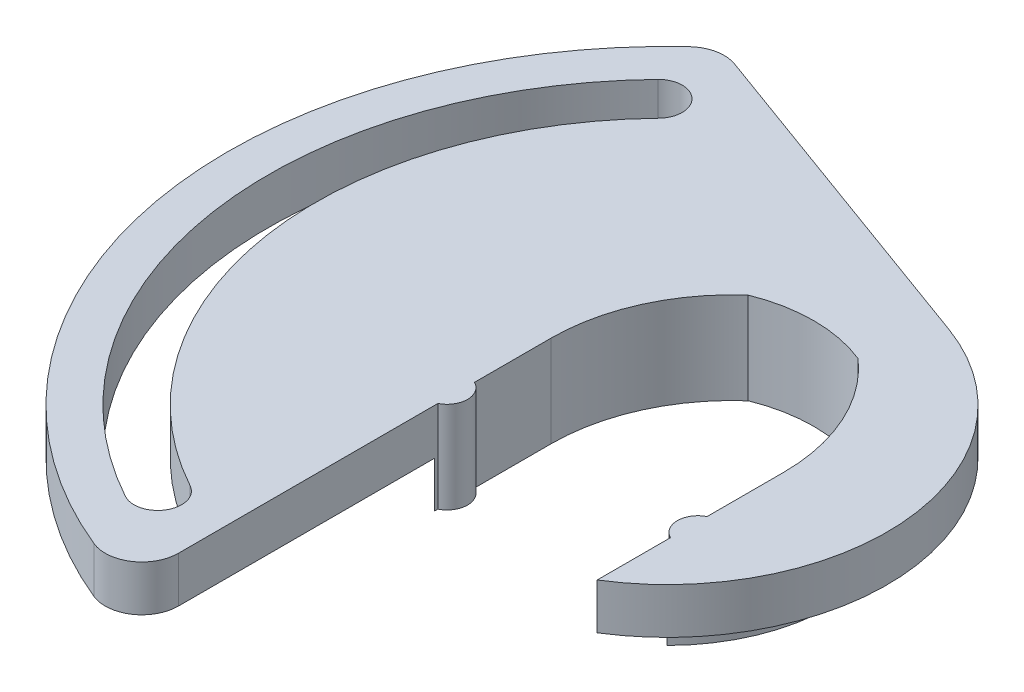
ISO-10303-21;
HEADER;
FILE_DESCRIPTION(('STEP AP214'),'2;1');
FILE_NAME('part.step','',(''),(''),'','','');
FILE_SCHEMA(('AUTOMOTIVE_DESIGN { 1 0 10303 214 1 1 1 1 }'));
ENDSEC;
DATA;
#1=APPLICATION_CONTEXT('core data for automotive mechanical design processes');
#2=APPLICATION_PROTOCOL_DEFINITION('international standard','automotive_design',2000,#1);
#3=PRODUCT_CONTEXT('',#1,'mechanical');
#4=PRODUCT('Part','Part','',(#3));
#5=PRODUCT_RELATED_PRODUCT_CATEGORY('part','',(#4));
#6=PRODUCT_DEFINITION_FORMATION('','',#4);
#7=PRODUCT_DEFINITION_CONTEXT('part definition',#1,'design');
#8=PRODUCT_DEFINITION('design','',#6,#7);
#9=PRODUCT_DEFINITION_SHAPE('','',#8);
#10=(LENGTH_UNIT() NAMED_UNIT(*) SI_UNIT(.MILLI.,.METRE.));
#11=(NAMED_UNIT(*) PLANE_ANGLE_UNIT() SI_UNIT($,.RADIAN.));
#12=(NAMED_UNIT(*) SI_UNIT($,.STERADIAN.) SOLID_ANGLE_UNIT());
#13=UNCERTAINTY_MEASURE_WITH_UNIT(LENGTH_MEASURE(1.E-05),#10,'distance_accuracy_value','');
#14=(GEOMETRIC_REPRESENTATION_CONTEXT(3) GLOBAL_UNCERTAINTY_ASSIGNED_CONTEXT((#13)) GLOBAL_UNIT_ASSIGNED_CONTEXT((#10,
#11,#12)) REPRESENTATION_CONTEXT('',''));
#15=CARTESIAN_POINT('',(0.,0.,0.));
#16=DIRECTION('',(0.,0.,1.));
#17=DIRECTION('',(1.,0.,0.));
#18=AXIS2_PLACEMENT_3D('',#15,#16,#17);
#19=CARTESIAN_POINT('',(-6.35,2.5,0.));
#20=DIRECTION('',(-1.,0.,0.));
#21=DIRECTION('',(0.,0.,1.));
#22=AXIS2_PLACEMENT_3D('',#19,#20,#21);
#23=PLANE('',#22);
#24=DIRECTION('',(0.,1.,0.));
#25=VECTOR('',#24,1.);
#26=CARTESIAN_POINT('',(-6.35,-2.09331459920627,6.18221488675229));
#27=LINE('',#26,#25);
#28=CARTESIAN_POINT('',(-6.35,0.,6.18221488675229));
#29=VERTEX_POINT('',#28);
#30=CARTESIAN_POINT('',(-6.35,5.,6.18221488675229));
#31=VERTEX_POINT('',#30);
#32=EDGE_CURVE('E174',#29,#31,#27,.T.);
#33=ORIENTED_EDGE('',*,*,#32,.T.);
#34=DIRECTION('',(0.,0.,-1.));
#35=VECTOR('',#34,1.);
#36=CARTESIAN_POINT('',(-6.35,5.,23.1447078184193));
#37=LINE('',#36,#35);
#38=CARTESIAN_POINT('',(-6.35,5.,20.3538079975222));
#39=VERTEX_POINT('',#38);
#40=EDGE_CURVE('E183',#39,#31,#37,.T.);
#41=ORIENTED_EDGE('',*,*,#40,.F.);
#42=DIRECTION('',(0.,-1.,0.));
#43=VECTOR('',#42,1.);
#44=CARTESIAN_POINT('',(-6.35,5.,20.3538079975222));
#45=LINE('',#44,#43);
#46=CARTESIAN_POINT('',(-6.35,2.5,20.3538079975222));
#47=VERTEX_POINT('',#46);
#48=EDGE_CURVE('E226',#39,#47,#45,.T.);
#49=ORIENTED_EDGE('',*,*,#48,.T.);
#50=DIRECTION('',(0.,0.,-1.));
#51=VECTOR('',#50,1.);
#52=CARTESIAN_POINT('',(-6.35,2.5,6.3778915011154));
#53=LINE('',#52,#51);
#54=CARTESIAN_POINT('',(-6.35,2.5,6.3778915011154));
#55=VERTEX_POINT('',#54);
#56=EDGE_CURVE('E217',#47,#55,#53,.T.);
#57=ORIENTED_EDGE('',*,*,#56,.T.);
#58=DIRECTION('',(0.,-1.,0.));
#59=VECTOR('',#58,1.);
#60=CARTESIAN_POINT('',(-6.35,2.5,6.3778915011154));
#61=LINE('',#60,#59);
#62=CARTESIAN_POINT('',(-6.35,0.,6.3778915011154));
#63=VERTEX_POINT('',#62);
#64=EDGE_CURVE('E280',#55,#63,#61,.T.);
#65=ORIENTED_EDGE('',*,*,#64,.T.);
#66=DIRECTION('',(0.,0.,-1.));
#67=VECTOR('',#66,1.);
#68=CARTESIAN_POINT('',(-6.35,0.,0.));
#69=LINE('',#68,#67);
#70=EDGE_CURVE('E187',#63,#29,#69,.T.);
#71=ORIENTED_EDGE('',*,*,#70,.T.);
#72=EDGE_LOOP('',(#33,#41,#49,#57,#65,#71));
#73=FACE_BOUND('',#72,.T.);
#74=ADVANCED_FACE('F35',(#73),#23,.F.);
#75=DIRECTION('',(0.,1.,0.));
#76=VECTOR('',#75,1.);
#77=CARTESIAN_POINT('',(-6.35,-2.09331459920627,4.18221488675229));
#78=LINE('',#77,#76);
#79=CARTESIAN_POINT('',(-6.35,0.,4.18221488675229));
#80=VERTEX_POINT('',#79);
#81=CARTESIAN_POINT('',(-6.35,5.,4.18221488675229));
#82=VERTEX_POINT('',#81);
#83=EDGE_CURVE('E177',#80,#82,#78,.T.);
#84=ORIENTED_EDGE('',*,*,#83,.F.);
#85=CARTESIAN_POINT('',(-6.35,0.,0.));
#86=VERTEX_POINT('',#85);
#87=EDGE_CURVE('E276',#80,#86,#69,.T.);
#88=ORIENTED_EDGE('',*,*,#87,.T.);
#89=DIRECTION('',(0.,-1.,0.));
#90=VECTOR('',#89,1.);
#91=CARTESIAN_POINT('',(-6.35,2.5,0.));
#92=LINE('',#91,#90);
#93=CARTESIAN_POINT('',(-6.35,5.,0.));
#94=VERTEX_POINT('',#93);
#95=EDGE_CURVE('E265',#94,#86,#92,.T.);
#96=ORIENTED_EDGE('',*,*,#95,.F.);
#97=EDGE_CURVE('E197',#82,#94,#37,.T.);
#98=ORIENTED_EDGE('',*,*,#97,.F.);
#99=EDGE_LOOP('',(#84,#88,#96,#98));
#100=FACE_BOUND('',#99,.T.);
#101=ADVANCED_FACE('F363',(#100),#23,.F.);
#102=CARTESIAN_POINT('',(6.35,2.5,6.3778915011154));
#103=DIRECTION('',(1.,0.,0.));
#104=DIRECTION('',(0.,0.,-1.));
#105=AXIS2_PLACEMENT_3D('',#102,#103,#104);
#106=PLANE('',#105);
#107=DIRECTION('',(0.,0.,1.));
#108=VECTOR('',#107,1.);
#109=CARTESIAN_POINT('',(6.35,0.,6.3778915011154));
#110=LINE('',#109,#108);
#111=CARTESIAN_POINT('',(6.35,0.,0.));
#112=VERTEX_POINT('',#111);
#113=CARTESIAN_POINT('',(6.35,0.,4.18221488675229));
#114=VERTEX_POINT('',#113);
#115=EDGE_CURVE('E58',#112,#114,#110,.T.);
#116=ORIENTED_EDGE('',*,*,#115,.T.);
#117=DIRECTION('',(0.,1.,0.));
#118=VECTOR('',#117,1.);
#119=CARTESIAN_POINT('',(6.35,-2.09331459920627,4.18221488675229));
#120=LINE('',#119,#118);
#121=CARTESIAN_POINT('',(6.35,5.,4.18221488675229));
#122=VERTEX_POINT('',#121);
#123=EDGE_CURVE('E258',#114,#122,#120,.T.);
#124=ORIENTED_EDGE('',*,*,#123,.T.);
#125=DIRECTION('',(0.,0.,1.));
#126=VECTOR('',#125,1.);
#127=CARTESIAN_POINT('',(6.35,5.,0.));
#128=LINE('',#127,#126);
#129=CARTESIAN_POINT('',(6.35,5.,0.));
#130=VERTEX_POINT('',#129);
#131=EDGE_CURVE('E309',#130,#122,#128,.T.);
#132=ORIENTED_EDGE('',*,*,#131,.F.);
#133=DIRECTION('',(0.,-1.,0.));
#134=VECTOR('',#133,1.);
#135=CARTESIAN_POINT('',(6.35,2.5,0.));
#136=LINE('',#135,#134);
#137=EDGE_CURVE('E285',#130,#112,#136,.T.);
#138=ORIENTED_EDGE('',*,*,#137,.T.);
#139=EDGE_LOOP('',(#116,#124,#132,#138));
#140=FACE_BOUND('',#139,.T.);
#141=ADVANCED_FACE('F308',(#140),#106,.F.);
#142=CARTESIAN_POINT('',(3.5339552238806,2.5,0.));
#143=DIRECTION('',(0.,-1.,0.));
#144=DIRECTION('',(0.,0.,-1.));
#145=AXIS2_PLACEMENT_3D('',#142,#143,#144);
#146=CYLINDRICAL_SURFACE('',#145,9.8839552238806);
#147=CARTESIAN_POINT('',(3.5339552238806,0.,0.));
#148=DIRECTION('',(0.,-1.,0.));
#149=DIRECTION('',(0.,0.,1.));
#150=AXIS2_PLACEMENT_3D('',#147,#148,#149);
#151=CIRCLE('',#150,9.8839552238806);
#152=CARTESIAN_POINT('',(-3.,0.,-7.41619848709566));
#153=VERTEX_POINT('',#152);
#154=EDGE_CURVE('E257',#86,#153,#151,.T.);
#155=ORIENTED_EDGE('',*,*,#154,.T.);
#156=DIRECTION('',(0.,-1.,0.));
#157=VECTOR('',#156,1.);
#158=CARTESIAN_POINT('',(-3.,2.5,-7.41619848709566));
#159=LINE('',#158,#157);
#160=CARTESIAN_POINT('',(-3.,5.,-7.41619848709566));
#161=VERTEX_POINT('',#160);
#162=EDGE_CURVE('E11',#161,#153,#159,.T.);
#163=ORIENTED_EDGE('',*,*,#162,.F.);
#164=CARTESIAN_POINT('',(3.5339552238806,5.,0.));
#165=DIRECTION('',(0.,-1.,0.));
#166=DIRECTION('',(0.,0.,1.));
#167=AXIS2_PLACEMENT_3D('',#164,#165,#166);
#168=CIRCLE('',#167,9.8839552238806);
#169=EDGE_CURVE('E196',#94,#161,#168,.T.);
#170=ORIENTED_EDGE('',*,*,#169,.F.);
#171=ORIENTED_EDGE('',*,*,#95,.T.);
#172=EDGE_LOOP('',(#155,#163,#170,#171));
#173=FACE_BOUND('',#172,.T.);
#174=ADVANCED_FACE('F37',(#173),#146,.F.);
#175=CARTESIAN_POINT('',(0.,2.5,0.));
#176=DIRECTION('',(0.,-1.,0.));
#177=DIRECTION('',(0.,0.,-1.));
#178=AXIS2_PLACEMENT_3D('',#175,#176,#177);
#179=CYLINDRICAL_SURFACE('',#178,8.);
#180=CARTESIAN_POINT('',(0.,0.,0.));
#181=DIRECTION('',(0.,-1.,0.));
#182=DIRECTION('',(0.,0.,-1.));
#183=AXIS2_PLACEMENT_3D('',#180,#181,#182);
#184=CIRCLE('',#183,8.);
#185=CARTESIAN_POINT('',(3.,0.,-7.41619848709566));
#186=VERTEX_POINT('',#185);
#187=EDGE_CURVE('E268',#153,#186,#184,.T.);
#188=ORIENTED_EDGE('',*,*,#187,.T.);
#189=DIRECTION('',(0.,-1.,0.));
#190=VECTOR('',#189,1.);
#191=CARTESIAN_POINT('',(3.,2.5,-7.41619848709566));
#192=LINE('',#191,#190);
#193=CARTESIAN_POINT('',(3.,5.,-7.41619848709566));
#194=VERTEX_POINT('',#193);
#195=EDGE_CURVE('E43',#194,#186,#192,.T.);
#196=ORIENTED_EDGE('',*,*,#195,.F.);
#197=CARTESIAN_POINT('',(0.,5.,0.));
#198=DIRECTION('',(0.,-1.,0.));
#199=DIRECTION('',(0.,0.,1.));
#200=AXIS2_PLACEMENT_3D('',#197,#198,#199);
#201=CIRCLE('',#200,8.);
#202=EDGE_CURVE('E220',#161,#194,#201,.T.);
#203=ORIENTED_EDGE('',*,*,#202,.F.);
#204=ORIENTED_EDGE('',*,*,#162,.T.);
#205=EDGE_LOOP('',(#188,#196,#203,#204));
#206=FACE_BOUND('',#205,.T.);
#207=ADVANCED_FACE('F359',(#206),#179,.F.);
#208=CARTESIAN_POINT('',(-3.5339552238806,2.5,0.));
#209=DIRECTION('',(0.,-1.,0.));
#210=DIRECTION('',(0.,0.,-1.));
#211=AXIS2_PLACEMENT_3D('',#208,#209,#210);
#212=CYLINDRICAL_SURFACE('',#211,9.8839552238806);
#213=CARTESIAN_POINT('',(-3.5339552238806,0.,0.));
#214=DIRECTION('',(0.,-1.,0.));
#215=DIRECTION('',(0.,0.,-1.));
#216=AXIS2_PLACEMENT_3D('',#213,#214,#215);
#217=CIRCLE('',#216,9.8839552238806);
#218=EDGE_CURVE('E270',#186,#112,#217,.T.);
#219=ORIENTED_EDGE('',*,*,#218,.T.);
#220=ORIENTED_EDGE('',*,*,#137,.F.);
#221=CARTESIAN_POINT('',(-3.5339552238806,5.,0.));
#222=DIRECTION('',(0.,-1.,0.));
#223=DIRECTION('',(0.,0.,1.));
#224=AXIS2_PLACEMENT_3D('',#221,#222,#223);
#225=CIRCLE('',#224,9.8839552238806);
#226=EDGE_CURVE('E292',#194,#130,#225,.T.);
#227=ORIENTED_EDGE('',*,*,#226,.F.);
#228=ORIENTED_EDGE('',*,*,#195,.T.);
#229=EDGE_LOOP('',(#219,#220,#227,#228));
#230=FACE_BOUND('',#229,.T.);
#231=ADVANCED_FACE('F290',(#230),#212,.F.);
#232=DIRECTION('',(0.,-1.,0.));
#233=VECTOR('',#232,1.);
#234=CARTESIAN_POINT('',(6.35,2.5,6.3778915011154));
#235=LINE('',#234,#233);
#236=CARTESIAN_POINT('',(6.35,2.5,6.3778915011154));
#237=VERTEX_POINT('',#236);
#238=CARTESIAN_POINT('',(6.35,0.,6.3778915011154));
#239=VERTEX_POINT('',#238);
#240=EDGE_CURVE('E282',#237,#239,#235,.T.);
#241=ORIENTED_EDGE('',*,*,#240,.F.);
#242=DIRECTION('',(0.,0.,1.));
#243=VECTOR('',#242,1.);
#244=CARTESIAN_POINT('',(6.35,2.5,0.));
#245=LINE('',#244,#243);
#246=CARTESIAN_POINT('',(6.35,2.5,10.1822148867523));
#247=VERTEX_POINT('',#246);
#248=EDGE_CURVE('E206',#237,#247,#245,.T.);
#249=ORIENTED_EDGE('',*,*,#248,.T.);
#250=DIRECTION('',(0.,-1.,0.));
#251=VECTOR('',#250,1.);
#252=CARTESIAN_POINT('',(6.35,5.,10.1822148867523));
#253=LINE('',#252,#251);
#254=CARTESIAN_POINT('',(6.35,5.,10.1822148867523));
#255=VERTEX_POINT('',#254);
#256=EDGE_CURVE('E223',#255,#247,#253,.T.);
#257=ORIENTED_EDGE('',*,*,#256,.F.);
#258=CARTESIAN_POINT('',(6.35,5.,6.18221488675229));
#259=VERTEX_POINT('',#258);
#260=EDGE_CURVE('E311',#259,#255,#128,.T.);
#261=ORIENTED_EDGE('',*,*,#260,.F.);
#262=DIRECTION('',(0.,1.,0.));
#263=VECTOR('',#262,1.);
#264=CARTESIAN_POINT('',(6.35,-2.09331459920627,6.18221488675229));
#265=LINE('',#264,#263);
#266=CARTESIAN_POINT('',(6.35,0.,6.18221488675229));
#267=VERTEX_POINT('',#266);
#268=EDGE_CURVE('E260',#267,#259,#265,.T.);
#269=ORIENTED_EDGE('',*,*,#268,.F.);
#270=EDGE_CURVE('E272',#267,#239,#110,.T.);
#271=ORIENTED_EDGE('',*,*,#270,.T.);
#272=EDGE_LOOP('',(#241,#249,#257,#261,#269,#271));
#273=FACE_BOUND('',#272,.T.);
#274=ADVANCED_FACE('F371',(#273),#106,.F.);
#275=CARTESIAN_POINT('',(0.,2.5,0.));
#276=DIRECTION('',(0.,-1.,0.));
#277=DIRECTION('',(0.,0.,-1.));
#278=AXIS2_PLACEMENT_3D('',#275,#276,#277);
#279=CYLINDRICAL_SURFACE('',#278,9.);
#280=CARTESIAN_POINT('',(0.,0.,0.));
#281=DIRECTION('',(0.,1.,0.));
#282=DIRECTION('',(0.,0.,-1.));
#283=AXIS2_PLACEMENT_3D('',#280,#281,#282);
#284=CIRCLE('',#283,9.);
#285=EDGE_CURVE('E274',#239,#63,#284,.T.);
#286=ORIENTED_EDGE('',*,*,#285,.T.);
#287=ORIENTED_EDGE('',*,*,#64,.F.);
#288=CARTESIAN_POINT('',(0.,2.5,0.));
#289=DIRECTION('',(0.,1.,0.));
#290=DIRECTION('',(0.,0.,-1.));
#291=AXIS2_PLACEMENT_3D('',#288,#289,#290);
#292=CIRCLE('',#291,9.);
#293=EDGE_CURVE('E263',#237,#55,#292,.T.);
#294=ORIENTED_EDGE('',*,*,#293,.F.);
#295=ORIENTED_EDGE('',*,*,#240,.T.);
#296=EDGE_LOOP('',(#286,#287,#294,#295));
#297=FACE_BOUND('',#296,.T.);
#298=ADVANCED_FACE('F335',(#297),#279,.T.);
#299=CARTESIAN_POINT('',(3.5339552238806,0.,0.));
#300=DIRECTION('',(0.,1.,0.));
#301=DIRECTION('',(0.,0.,1.));
#302=AXIS2_PLACEMENT_3D('',#299,#300,#301);
#303=PLANE('',#302);
#304=ORIENTED_EDGE('',*,*,#154,.F.);
#305=ORIENTED_EDGE('',*,*,#87,.F.);
#306=CARTESIAN_POINT('',(-6.85,0.,5.18221488675229));
#307=DIRECTION('',(0.,1.,0.));
#308=DIRECTION('',(0.,0.,1.));
#309=AXIS2_PLACEMENT_3D('',#306,#307,#308);
#310=CIRCLE('',#309,1.11803398874989);
#311=EDGE_CURVE('E188',#29,#80,#310,.T.);
#312=ORIENTED_EDGE('',*,*,#311,.F.);
#313=ORIENTED_EDGE('',*,*,#70,.F.);
#314=ORIENTED_EDGE('',*,*,#285,.F.);
#315=ORIENTED_EDGE('',*,*,#270,.F.);
#316=CARTESIAN_POINT('',(6.85,0.,5.18221488675229));
#317=DIRECTION('',(0.,1.,0.));
#318=DIRECTION('',(0.,0.,1.));
#319=AXIS2_PLACEMENT_3D('',#316,#317,#318);
#320=CIRCLE('',#319,1.11803398874989);
#321=EDGE_CURVE('E255',#267,#114,#320,.F.);
#322=ORIENTED_EDGE('',*,*,#321,.T.);
#323=ORIENTED_EDGE('',*,*,#115,.F.);
#324=ORIENTED_EDGE('',*,*,#218,.F.);
#325=ORIENTED_EDGE('',*,*,#187,.F.);
#326=EDGE_LOOP('',(#304,#305,#312,#313,#314,#315,#322,#323,#324,#325));
#327=FACE_BOUND('',#326,.T.);
#328=ADVANCED_FACE('F298',(#327),#303,.F.);
#329=CARTESIAN_POINT('',(6.85,-2.09331459920627,5.18221488675229));
#330=DIRECTION('',(0.,1.,0.));
#331=DIRECTION('',(0.,0.,1.));
#332=AXIS2_PLACEMENT_3D('',#329,#330,#331);
#333=CYLINDRICAL_SURFACE('',#332,1.11803398874989);
#334=ORIENTED_EDGE('',*,*,#321,.F.);
#335=ORIENTED_EDGE('',*,*,#268,.T.);
#336=CARTESIAN_POINT('',(6.85,5.,5.18221488675229));
#337=DIRECTION('',(0.,1.,0.));
#338=DIRECTION('',(0.,0.,-1.));
#339=AXIS2_PLACEMENT_3D('',#336,#337,#338);
#340=CIRCLE('',#339,1.11803398874989);
#341=EDGE_CURVE('E254',#122,#259,#340,.T.);
#342=ORIENTED_EDGE('',*,*,#341,.F.);
#343=ORIENTED_EDGE('',*,*,#123,.F.);
#344=EDGE_LOOP('',(#334,#335,#342,#343));
#345=FACE_BOUND('',#344,.T.);
#346=ADVANCED_FACE('F305',(#345),#333,.T.);
#347=CARTESIAN_POINT('',(6.85,5.,5.18221488675229));
#348=DIRECTION('',(0.,-1.,0.));
#349=DIRECTION('',(0.,0.,-1.));
#350=AXIS2_PLACEMENT_3D('',#347,#348,#349);
#351=PLANE('',#350);
#352=ORIENTED_EDGE('',*,*,#341,.T.);
#353=ORIENTED_EDGE('',*,*,#260,.T.);
#354=CARTESIAN_POINT('',(0.,5.,0.));
#355=DIRECTION('',(0.,1.,0.));
#356=DIRECTION('',(0.,0.,1.));
#357=AXIS2_PLACEMENT_3D('',#354,#355,#356);
#358=CIRCLE('',#357,12.);
#359=CARTESIAN_POINT('',(4.10424171990809,5.,-11.2763114494309));
#360=VERTEX_POINT('',#359);
#361=EDGE_CURVE('E310',#255,#360,#358,.T.);
#362=ORIENTED_EDGE('',*,*,#361,.T.);
#363=DIRECTION('',(-0.939692620785907,0.,-0.342020143325674));
#364=VECTOR('',#363,1.);
#365=CARTESIAN_POINT('',(4.10424171990809,5.,-11.2763114494309));
#366=LINE('',#365,#364);
#367=CARTESIAN_POINT('',(-14.3098977679649,5.,-17.9785101126426));
#368=VERTEX_POINT('',#367);
#369=EDGE_CURVE('E313',#360,#368,#366,.T.);
#370=ORIENTED_EDGE('',*,*,#369,.T.);
#371=CARTESIAN_POINT('',(-14.9939380546162,5.,-16.0991248710708));
#372=DIRECTION('',(0.,1.,0.));
#373=DIRECTION('',(0.,0.,1.));
#374=AXIS2_PLACEMENT_3D('',#371,#372,#373);
#375=CIRCLE('',#374,2.);
#376=CARTESIAN_POINT('',(-16.3570233323086,5.,-17.5626816775318));
#377=VERTEX_POINT('',#376);
#378=EDGE_CURVE('E237',#368,#377,#375,.T.);
#379=ORIENTED_EDGE('',*,*,#378,.T.);
#380=CARTESIAN_POINT('',(0.,5.,0.));
#381=DIRECTION('',(0.,1.,0.));
#382=DIRECTION('',(0.,0.,-1.));
#383=AXIS2_PLACEMENT_3D('',#380,#381,#382);
#384=CIRCLE('',#383,24.);
#385=CARTESIAN_POINT('',(-9.10909090909091,5.,22.2041541791152));
#386=VERTEX_POINT('',#385);
#387=EDGE_CURVE('E202',#377,#386,#384,.T.);
#388=ORIENTED_EDGE('',*,*,#387,.T.);
#389=CARTESIAN_POINT('',(-8.35,5.,20.3538079975222));
#390=DIRECTION('',(0.,1.,0.));
#391=DIRECTION('',(0.,0.,1.));
#392=AXIS2_PLACEMENT_3D('',#389,#390,#391);
#393=CIRCLE('',#392,2.);
#394=EDGE_CURVE('E195',#386,#39,#393,.T.);
#395=ORIENTED_EDGE('',*,*,#394,.T.);
#396=ORIENTED_EDGE('',*,*,#40,.T.);
#397=CARTESIAN_POINT('',(-6.85,5.,5.18221488675229));
#398=DIRECTION('',(0.,-1.,0.));
#399=DIRECTION('',(0.,0.,-1.));
#400=AXIS2_PLACEMENT_3D('',#397,#398,#399);
#401=CIRCLE('',#400,1.11803398874989);
#402=EDGE_CURVE('E50',#82,#31,#401,.T.);
#403=ORIENTED_EDGE('',*,*,#402,.F.);
#404=ORIENTED_EDGE('',*,*,#97,.T.);
#405=ORIENTED_EDGE('',*,*,#169,.T.);
#406=ORIENTED_EDGE('',*,*,#202,.T.);
#407=ORIENTED_EDGE('',*,*,#226,.T.);
#408=ORIENTED_EDGE('',*,*,#131,.T.);
#409=EDGE_LOOP('',(#352,#353,#362,#370,#379,#388,#395,#396,#403,#404,#405,#406,#407,#408));
#410=FACE_BOUND('',#409,.T.);
#411=CARTESIAN_POINT('',(0.,5.,0.));
#412=DIRECTION('',(0.,-1.,0.));
#413=DIRECTION('',(0.,0.,1.));
#414=AXIS2_PLACEMENT_3D('',#411,#412,#413);
#415=CIRCLE('',#414,19.2);
#416=CARTESIAN_POINT('',(-9.23213935983503,5.,16.8347142191541));
#417=VERTEX_POINT('',#416);
#418=CARTESIAN_POINT('',(-13.805303068964,5.,-13.3436729266742));
#419=VERTEX_POINT('',#418);
#420=EDGE_CURVE('E337',#417,#419,#415,.T.);
#421=ORIENTED_EDGE('',*,*,#420,.F.);
#422=CARTESIAN_POINT('',(-9.85723212899046,5.,17.9745646610759));
#423=DIRECTION('',(0.,1.,0.));
#424=DIRECTION('',(0.,0.,-1.));
#425=AXIS2_PLACEMENT_3D('',#422,#423,#424);
#426=CIRCLE('',#425,1.29999999999986);
#427=CARTESIAN_POINT('',(-10.4823248981459,5.,19.1144151029977));
#428=VERTEX_POINT('',#427);
#429=EDGE_CURVE('E348',#428,#417,#426,.T.);
#430=ORIENTED_EDGE('',*,*,#429,.F.);
#431=CARTESIAN_POINT('',(0.,5.,0.));
#432=DIRECTION('',(0.,1.,0.));
#433=DIRECTION('',(0.,0.,1.));
#434=AXIS2_PLACEMENT_3D('',#431,#432,#433);
#435=CIRCLE('',#434,21.7999999999997);
#436=CARTESIAN_POINT('',(-15.6747711928859,5.,-15.1506286354944));
#437=VERTEX_POINT('',#436);
#438=EDGE_CURVE('E345',#437,#428,#435,.T.);
#439=ORIENTED_EDGE('',*,*,#438,.F.);
#440=CARTESIAN_POINT('',(-14.740037130925,5.,-14.2471507810844));
#441=DIRECTION('',(0.,1.,0.));
#442=DIRECTION('',(0.,0.,-1.));
#443=AXIS2_PLACEMENT_3D('',#440,#441,#442);
#444=CIRCLE('',#443,1.29999999999986);
#445=EDGE_CURVE('E339',#419,#437,#444,.T.);
#446=ORIENTED_EDGE('',*,*,#445,.F.);
#447=EDGE_LOOP('',(#421,#430,#439,#446));
#448=FACE_BOUND('',#447,.T.);
#449=ADVANCED_FACE('F191',(#410,#448),#351,.F.);
#450=CARTESIAN_POINT('',(0.,2.5,0.));
#451=DIRECTION('',(0.,1.,0.));
#452=DIRECTION('',(0.,0.,1.));
#453=AXIS2_PLACEMENT_3D('',#450,#451,#452);
#454=PLANE('',#453);
#455=CARTESIAN_POINT('',(-9.85723212899046,2.5,17.9745646610759));
#456=DIRECTION('',(0.,1.,0.));
#457=DIRECTION('',(0.,0.,1.));
#458=AXIS2_PLACEMENT_3D('',#455,#456,#457);
#459=CIRCLE('',#458,1.29999999999986);
#460=CARTESIAN_POINT('',(-10.4823248981459,2.5,19.1144151029977));
#461=VERTEX_POINT('',#460);
#462=CARTESIAN_POINT('',(-9.23213935983503,2.5,16.8347142191541));
#463=VERTEX_POINT('',#462);
#464=EDGE_CURVE('E248',#461,#463,#459,.T.);
#465=ORIENTED_EDGE('',*,*,#464,.T.);
#466=CARTESIAN_POINT('',(0.,2.5,0.));
#467=DIRECTION('',(0.,1.,0.));
#468=DIRECTION('',(0.,0.,1.));
#469=AXIS2_PLACEMENT_3D('',#466,#467,#468);
#470=CIRCLE('',#469,19.2);
#471=CARTESIAN_POINT('',(-13.805303068964,2.5,-13.3436729266742));
#472=VERTEX_POINT('',#471);
#473=EDGE_CURVE('E251',#463,#472,#470,.F.);
#474=ORIENTED_EDGE('',*,*,#473,.T.);
#475=CARTESIAN_POINT('',(-14.740037130925,2.5,-14.2471507810844));
#476=DIRECTION('',(0.,1.,0.));
#477=DIRECTION('',(0.,0.,1.));
#478=AXIS2_PLACEMENT_3D('',#475,#476,#477);
#479=CIRCLE('',#478,1.29999999999986);
#480=CARTESIAN_POINT('',(-15.674771192886,2.5,-15.1506286354945));
#481=VERTEX_POINT('',#480);
#482=EDGE_CURVE('E242',#472,#481,#479,.T.);
#483=ORIENTED_EDGE('',*,*,#482,.T.);
#484=CARTESIAN_POINT('',(0.,2.5,0.));
#485=DIRECTION('',(0.,1.,0.));
#486=DIRECTION('',(0.,0.,1.));
#487=AXIS2_PLACEMENT_3D('',#484,#485,#486);
#488=CIRCLE('',#487,21.7999999999997);
#489=EDGE_CURVE('E245',#481,#461,#488,.T.);
#490=ORIENTED_EDGE('',*,*,#489,.T.);
#491=EDGE_LOOP('',(#465,#474,#483,#490));
#492=FACE_BOUND('',#491,.T.);
#493=ORIENTED_EDGE('',*,*,#248,.F.);
#494=ORIENTED_EDGE('',*,*,#293,.T.);
#495=ORIENTED_EDGE('',*,*,#56,.F.);
#496=CARTESIAN_POINT('',(-8.35,2.5,20.3538079975222));
#497=DIRECTION('',(0.,1.,0.));
#498=DIRECTION('',(0.,0.,1.));
#499=AXIS2_PLACEMENT_3D('',#496,#497,#498);
#500=CIRCLE('',#499,2.);
#501=CARTESIAN_POINT('',(-9.10909090909091,2.5,22.2041541791152));
#502=VERTEX_POINT('',#501);
#503=EDGE_CURVE('E230',#47,#502,#500,.F.);
#504=ORIENTED_EDGE('',*,*,#503,.T.);
#505=CARTESIAN_POINT('',(0.,2.5,0.));
#506=DIRECTION('',(0.,1.,0.));
#507=DIRECTION('',(0.,0.,-1.));
#508=AXIS2_PLACEMENT_3D('',#505,#506,#507);
#509=CIRCLE('',#508,24.);
#510=CARTESIAN_POINT('',(-16.3570233323086,2.5,-17.5626816775318));
#511=VERTEX_POINT('',#510);
#512=EDGE_CURVE('E214',#511,#502,#509,.T.);
#513=ORIENTED_EDGE('',*,*,#512,.F.);
#514=CARTESIAN_POINT('',(-14.9939380546162,2.5,-16.0991248710708));
#515=DIRECTION('',(0.,1.,0.));
#516=DIRECTION('',(0.,0.,1.));
#517=AXIS2_PLACEMENT_3D('',#514,#515,#516);
#518=CIRCLE('',#517,2.);
#519=CARTESIAN_POINT('',(-14.3098977679649,2.5,-17.9785101126426));
#520=VERTEX_POINT('',#519);
#521=EDGE_CURVE('E228',#511,#520,#518,.F.);
#522=ORIENTED_EDGE('',*,*,#521,.T.);
#523=DIRECTION('',(-0.939692620785907,0.,-0.342020143325674));
#524=VECTOR('',#523,1.);
#525=CARTESIAN_POINT('',(4.10424171990809,2.5,-11.2763114494309));
#526=LINE('',#525,#524);
#527=CARTESIAN_POINT('',(4.10424171990809,2.5,-11.2763114494309));
#528=VERTEX_POINT('',#527);
#529=EDGE_CURVE('E211',#528,#520,#526,.T.);
#530=ORIENTED_EDGE('',*,*,#529,.F.);
#531=CARTESIAN_POINT('',(0.,2.5,0.));
#532=DIRECTION('',(0.,1.,0.));
#533=DIRECTION('',(0.,0.,1.));
#534=AXIS2_PLACEMENT_3D('',#531,#532,#533);
#535=CIRCLE('',#534,12.);
#536=EDGE_CURVE('E208',#247,#528,#535,.T.);
#537=ORIENTED_EDGE('',*,*,#536,.F.);
#538=EDGE_LOOP('',(#493,#494,#495,#504,#513,#522,#530,#537));
#539=FACE_BOUND('',#538,.T.);
#540=ADVANCED_FACE('F329',(#492,#539),#454,.F.);
#541=CARTESIAN_POINT('',(0.,5.,0.));
#542=DIRECTION('',(0.,-1.,0.));
#543=DIRECTION('',(0.,0.,-1.));
#544=AXIS2_PLACEMENT_3D('',#541,#542,#543);
#545=CYLINDRICAL_SURFACE('',#544,12.);
#546=ORIENTED_EDGE('',*,*,#536,.T.);
#547=DIRECTION('',(0.,-1.,0.));
#548=VECTOR('',#547,1.);
#549=CARTESIAN_POINT('',(4.10424171990809,5.,-11.2763114494309));
#550=LINE('',#549,#548);
#551=EDGE_CURVE('E200',#360,#528,#550,.T.);
#552=ORIENTED_EDGE('',*,*,#551,.F.);
#553=ORIENTED_EDGE('',*,*,#361,.F.);
#554=ORIENTED_EDGE('',*,*,#256,.T.);
#555=EDGE_LOOP('',(#546,#552,#553,#554));
#556=FACE_BOUND('',#555,.T.);
#557=ADVANCED_FACE('F553',(#556),#545,.T.);
#558=CARTESIAN_POINT('',(4.10424171990809,5.,-11.2763114494309));
#559=DIRECTION('',(-0.342020143325674,0.,0.939692620785907));
#560=DIRECTION('',(0.939692620785907,0.,0.342020143325674));
#561=AXIS2_PLACEMENT_3D('',#558,#559,#560);
#562=PLANE('',#561);
#563=ORIENTED_EDGE('',*,*,#529,.T.);
#564=DIRECTION('',(0.,-1.,0.));
#565=VECTOR('',#564,1.);
#566=CARTESIAN_POINT('',(-14.3098977679649,5.,-17.9785101126426));
#567=LINE('',#566,#565);
#568=EDGE_CURVE('E240',#520,#368,#567,.F.);
#569=ORIENTED_EDGE('',*,*,#568,.T.);
#570=ORIENTED_EDGE('',*,*,#369,.F.);
#571=ORIENTED_EDGE('',*,*,#551,.T.);
#572=EDGE_LOOP('',(#563,#569,#570,#571));
#573=FACE_BOUND('',#572,.T.);
#574=ADVANCED_FACE('F544',(#573),#562,.F.);
#575=CARTESIAN_POINT('',(0.,5.,0.));
#576=DIRECTION('',(0.,-1.,0.));
#577=DIRECTION('',(0.,0.,-1.));
#578=AXIS2_PLACEMENT_3D('',#575,#576,#577);
#579=CYLINDRICAL_SURFACE('',#578,24.);
#580=ORIENTED_EDGE('',*,*,#512,.T.);
#581=DIRECTION('',(0.,-1.,0.));
#582=VECTOR('',#581,1.);
#583=CARTESIAN_POINT('',(-9.10909090909091,5.,22.2041541791152));
#584=LINE('',#583,#582);
#585=EDGE_CURVE('E235',#502,#386,#584,.F.);
#586=ORIENTED_EDGE('',*,*,#585,.T.);
#587=ORIENTED_EDGE('',*,*,#387,.F.);
#588=DIRECTION('',(0.,-1.,0.));
#589=VECTOR('',#588,1.);
#590=CARTESIAN_POINT('',(-16.3570233323086,5.,-17.5626816775318));
#591=LINE('',#590,#589);
#592=EDGE_CURVE('E232',#377,#511,#591,.T.);
#593=ORIENTED_EDGE('',*,*,#592,.T.);
#594=EDGE_LOOP('',(#580,#586,#587,#593));
#595=FACE_BOUND('',#594,.T.);
#596=ADVANCED_FACE('F535',(#595),#579,.T.);
#597=CARTESIAN_POINT('',(-8.35,5.,20.3538079975222));
#598=DIRECTION('',(0.,-1.,0.));
#599=DIRECTION('',(0.,0.,-1.));
#600=AXIS2_PLACEMENT_3D('',#597,#598,#599);
#601=CYLINDRICAL_SURFACE('',#600,2.);
#602=ORIENTED_EDGE('',*,*,#394,.F.);
#603=ORIENTED_EDGE('',*,*,#585,.F.);
#604=ORIENTED_EDGE('',*,*,#503,.F.);
#605=ORIENTED_EDGE('',*,*,#48,.F.);
#606=EDGE_LOOP('',(#602,#603,#604,#605));
#607=FACE_BOUND('',#606,.T.);
#608=ADVANCED_FACE('F325',(#607),#601,.T.);
#609=CARTESIAN_POINT('',(-14.9939380546162,5.,-16.0991248710708));
#610=DIRECTION('',(0.,-1.,0.));
#611=DIRECTION('',(0.,0.,-1.));
#612=AXIS2_PLACEMENT_3D('',#609,#610,#611);
#613=CYLINDRICAL_SURFACE('',#612,2.);
#614=ORIENTED_EDGE('',*,*,#378,.F.);
#615=ORIENTED_EDGE('',*,*,#568,.F.);
#616=ORIENTED_EDGE('',*,*,#521,.F.);
#617=ORIENTED_EDGE('',*,*,#592,.F.);
#618=EDGE_LOOP('',(#614,#615,#616,#617));
#619=FACE_BOUND('',#618,.T.);
#620=ADVANCED_FACE('F516',(#619),#613,.T.);
#621=CARTESIAN_POINT('',(0.,0.,0.));
#622=DIRECTION('',(0.,1.,0.));
#623=DIRECTION('',(0.,0.,1.));
#624=AXIS2_PLACEMENT_3D('',#621,#622,#623);
#625=CYLINDRICAL_SURFACE('',#624,19.2);
#626=DIRECTION('',(0.,1.,0.));
#627=VECTOR('',#626,1.);
#628=CARTESIAN_POINT('',(-9.23213935983503,0.,16.8347142191541));
#629=LINE('',#628,#627);
#630=EDGE_CURVE('E209',#463,#417,#629,.T.);
#631=ORIENTED_EDGE('',*,*,#630,.T.);
#632=ORIENTED_EDGE('',*,*,#420,.T.);
#633=DIRECTION('',(0.,1.,0.));
#634=VECTOR('',#633,1.);
#635=CARTESIAN_POINT('',(-13.805303068964,0.,-13.3436729266742));
#636=LINE('',#635,#634);
#637=EDGE_CURVE('E351',#472,#419,#636,.T.);
#638=ORIENTED_EDGE('',*,*,#637,.F.);
#639=ORIENTED_EDGE('',*,*,#473,.F.);
#640=EDGE_LOOP('',(#631,#632,#638,#639));
#641=FACE_BOUND('',#640,.T.);
#642=ADVANCED_FACE('F506',(#641),#625,.T.);
#643=CARTESIAN_POINT('',(-9.85723212899046,0.,17.9745646610759));
#644=DIRECTION('',(0.,1.,0.));
#645=DIRECTION('',(0.,0.,1.));
#646=AXIS2_PLACEMENT_3D('',#643,#644,#645);
#647=CYLINDRICAL_SURFACE('',#646,1.29999999999986);
#648=DIRECTION('',(0.,1.,0.));
#649=VECTOR('',#648,1.);
#650=CARTESIAN_POINT('',(-10.4823248981459,0.,19.1144151029977));
#651=LINE('',#650,#649);
#652=EDGE_CURVE('E353',#461,#428,#651,.T.);
#653=ORIENTED_EDGE('',*,*,#652,.T.);
#654=ORIENTED_EDGE('',*,*,#429,.T.);
#655=ORIENTED_EDGE('',*,*,#630,.F.);
#656=ORIENTED_EDGE('',*,*,#464,.F.);
#657=EDGE_LOOP('',(#653,#654,#655,#656));
#658=FACE_BOUND('',#657,.T.);
#659=ADVANCED_FACE('F496',(#658),#647,.F.);
#660=CARTESIAN_POINT('',(0.,0.,0.));
#661=DIRECTION('',(0.,1.,0.));
#662=DIRECTION('',(0.,0.,1.));
#663=AXIS2_PLACEMENT_3D('',#660,#661,#662);
#664=CYLINDRICAL_SURFACE('',#663,21.7999999999997);
#665=DIRECTION('',(0.,1.,0.));
#666=VECTOR('',#665,1.);
#667=CARTESIAN_POINT('',(-15.6747711928859,0.,-15.1506286354944));
#668=LINE('',#667,#666);
#669=EDGE_CURVE('E355',#481,#437,#668,.T.);
#670=ORIENTED_EDGE('',*,*,#669,.T.);
#671=ORIENTED_EDGE('',*,*,#438,.T.);
#672=ORIENTED_EDGE('',*,*,#652,.F.);
#673=ORIENTED_EDGE('',*,*,#489,.F.);
#674=EDGE_LOOP('',(#670,#671,#672,#673));
#675=FACE_BOUND('',#674,.T.);
#676=ADVANCED_FACE('F485',(#675),#664,.F.);
#677=CARTESIAN_POINT('',(-14.740037130925,0.,-14.2471507810844));
#678=DIRECTION('',(0.,1.,0.));
#679=DIRECTION('',(0.,0.,1.));
#680=AXIS2_PLACEMENT_3D('',#677,#678,#679);
#681=CYLINDRICAL_SURFACE('',#680,1.29999999999986);
#682=ORIENTED_EDGE('',*,*,#637,.T.);
#683=ORIENTED_EDGE('',*,*,#445,.T.);
#684=ORIENTED_EDGE('',*,*,#669,.F.);
#685=ORIENTED_EDGE('',*,*,#482,.F.);
#686=EDGE_LOOP('',(#682,#683,#684,#685));
#687=FACE_BOUND('',#686,.T.);
#688=ADVANCED_FACE('F481',(#687),#681,.F.);
#689=CARTESIAN_POINT('',(-6.85,-2.09331459920627,5.18221488675229));
#690=DIRECTION('',(0.,1.,0.));
#691=DIRECTION('',(0.,0.,1.));
#692=AXIS2_PLACEMENT_3D('',#689,#690,#691);
#693=CYLINDRICAL_SURFACE('',#692,1.11803398874989);
#694=ORIENTED_EDGE('',*,*,#32,.F.);
#695=ORIENTED_EDGE('',*,*,#311,.T.);
#696=ORIENTED_EDGE('',*,*,#83,.T.);
#697=ORIENTED_EDGE('',*,*,#402,.T.);
#698=EDGE_LOOP('',(#694,#695,#696,#697));
#699=FACE_BOUND('',#698,.T.);
#700=ADVANCED_FACE('F173',(#699),#693,.T.);
#701=CLOSED_SHELL('',(#74,#101,#141,#174,#207,#231,#274,#298,#328,#346,#449,#540,#557,#574,#596,
#608,#620,#642,#659,#676,#688,#700));
#702=MANIFOLD_SOLID_BREP('B2',#701);
#703=ADVANCED_BREP_SHAPE_REPRESENTATION('',(#18,#702),#14);
#704=SHAPE_DEFINITION_REPRESENTATION(#9,#703);
ENDSEC;
END-ISO-10303-21;
